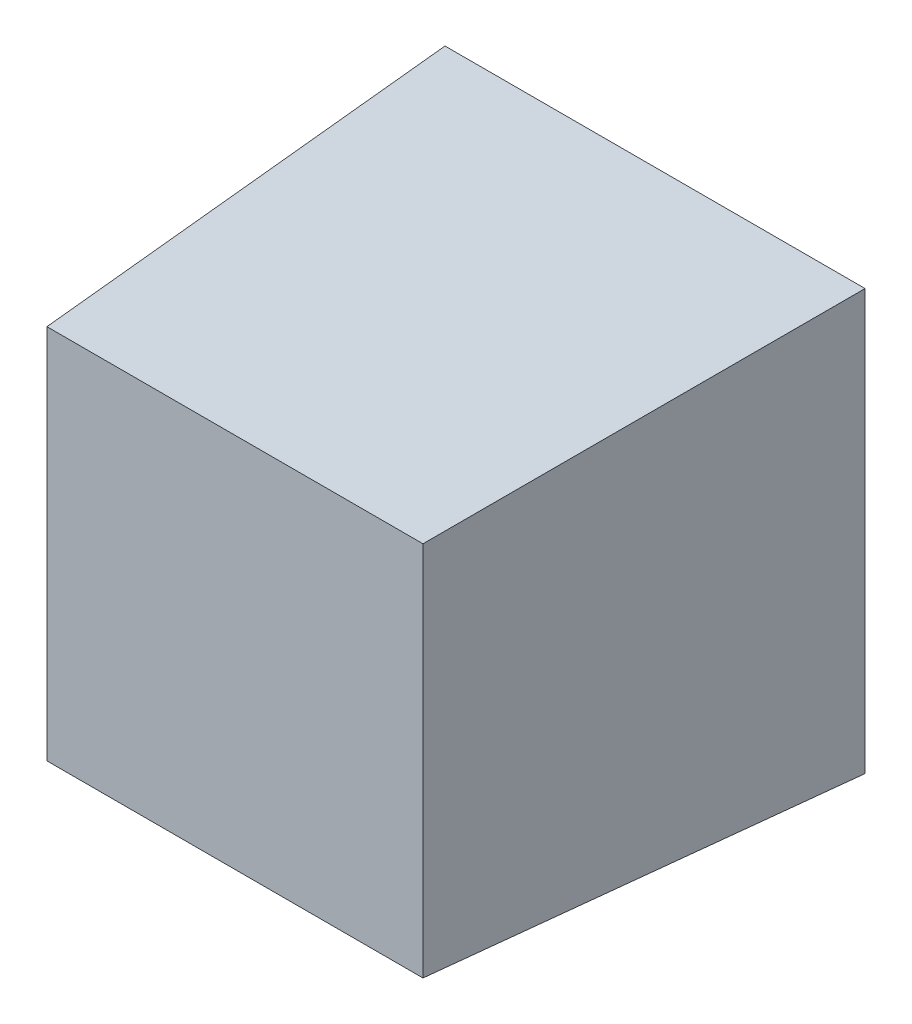
ISO-10303-21;
HEADER;
FILE_DESCRIPTION(('STEP AP214'),'2;1');
FILE_NAME('part.step','',(''),(''),'','','');
FILE_SCHEMA(('AUTOMOTIVE_DESIGN { 1 0 10303 214 1 1 1 1 }'));
ENDSEC;
DATA;
#1=APPLICATION_CONTEXT('core data for automotive mechanical design processes');
#2=APPLICATION_PROTOCOL_DEFINITION('international standard','automotive_design',2000,#1);
#3=PRODUCT_CONTEXT('',#1,'mechanical');
#4=PRODUCT('Part','Part','',(#3));
#5=PRODUCT_RELATED_PRODUCT_CATEGORY('part','',(#4));
#6=PRODUCT_DEFINITION_FORMATION('','',#4);
#7=PRODUCT_DEFINITION_CONTEXT('part definition',#1,'design');
#8=PRODUCT_DEFINITION('design','',#6,#7);
#9=PRODUCT_DEFINITION_SHAPE('','',#8);
#10=(LENGTH_UNIT() NAMED_UNIT(*) SI_UNIT(.MILLI.,.METRE.));
#11=(NAMED_UNIT(*) PLANE_ANGLE_UNIT() SI_UNIT($,.RADIAN.));
#12=(NAMED_UNIT(*) SI_UNIT($,.STERADIAN.) SOLID_ANGLE_UNIT());
#13=UNCERTAINTY_MEASURE_WITH_UNIT(LENGTH_MEASURE(1.E-05),#10,'distance_accuracy_value','');
#14=(GEOMETRIC_REPRESENTATION_CONTEXT(3) GLOBAL_UNCERTAINTY_ASSIGNED_CONTEXT((#13)) GLOBAL_UNIT_ASSIGNED_CONTEXT((#10,
#11,#12)) REPRESENTATION_CONTEXT('',''));
#15=CARTESIAN_POINT('',(0.,0.,0.));
#16=DIRECTION('',(0.,0.,1.));
#17=DIRECTION('',(1.,0.,0.));
#18=AXIS2_PLACEMENT_3D('',#15,#16,#17);
#19=CARTESIAN_POINT('',(0.,0.,0.));
#20=DIRECTION('',(-0.998629534754574,0.,0.0523359562429438));
#21=DIRECTION('',(0.0523359562429438,0.,0.998629534754574));
#22=AXIS2_PLACEMENT_3D('',#19,#20,#21);
#23=PLANE('',#22);
#24=DIRECTION('',(0.,-1.,0.));
#25=VECTOR('',#24,1.);
#26=CARTESIAN_POINT('',(0.,0.,0.));
#27=LINE('',#26,#25);
#28=CARTESIAN_POINT('',(0.,10.,0.));
#29=VERTEX_POINT('',#28);
#30=CARTESIAN_POINT('',(0.,0.,0.));
#31=VERTEX_POINT('',#30);
#32=EDGE_CURVE('E90',#29,#31,#27,.T.);
#33=ORIENTED_EDGE('',*,*,#32,.T.);
#34=DIRECTION('',(-0.0522644276887139,-0.0522644276887139,-0.997264688634237));
#35=VECTOR('',#34,1.);
#36=CARTESIAN_POINT('',(0.,0.,0.));
#37=LINE('',#36,#35);
#38=CARTESIAN_POINT('',(0.524077792830412,0.524077792830412,10.));
#39=VERTEX_POINT('',#38);
#40=EDGE_CURVE('E11',#39,#31,#37,.T.);
#41=ORIENTED_EDGE('',*,*,#40,.F.);
#42=DIRECTION('',(0.,1.,0.));
#43=VECTOR('',#42,1.);
#44=CARTESIAN_POINT('',(0.524077792830412,0.,10.));
#45=LINE('',#44,#43);
#46=CARTESIAN_POINT('',(0.524077792830412,9.47592220716959,10.));
#47=VERTEX_POINT('',#46);
#48=EDGE_CURVE('E104',#47,#39,#45,.F.);
#49=ORIENTED_EDGE('',*,*,#48,.F.);
#50=DIRECTION('',(-0.0522644276887139,0.0522644276887139,-0.997264688634237));
#51=VECTOR('',#50,1.);
#52=CARTESIAN_POINT('',(0.0273157040162881,9.97268429598371,0.521214682056319));
#53=LINE('',#52,#51);
#54=EDGE_CURVE('E99',#47,#29,#53,.T.);
#55=ORIENTED_EDGE('',*,*,#54,.T.);
#56=EDGE_LOOP('',(#33,#41,#49,#55));
#57=FACE_BOUND('',#56,.T.);
#58=ADVANCED_FACE('F43',(#57),#23,.T.);
#59=CARTESIAN_POINT('',(0.,0.,0.));
#60=DIRECTION('',(0.,-0.998629534754574,0.0523359562429438));
#61=DIRECTION('',(0.,0.0523359562429438,0.998629534754574));
#62=AXIS2_PLACEMENT_3D('',#59,#60,#61);
#63=PLANE('',#62);
#64=DIRECTION('',(1.,0.,0.));
#65=VECTOR('',#64,1.);
#66=CARTESIAN_POINT('',(0.,0.,0.));
#67=LINE('',#66,#65);
#68=CARTESIAN_POINT('',(10.,0.,0.));
#69=VERTEX_POINT('',#68);
#70=EDGE_CURVE('E81',#31,#69,#67,.T.);
#71=ORIENTED_EDGE('',*,*,#70,.T.);
#72=DIRECTION('',(0.0522644276887139,-0.0522644276887139,-0.997264688634237));
#73=VECTOR('',#72,1.);
#74=CARTESIAN_POINT('',(10.,0.,0.));
#75=LINE('',#74,#73);
#76=CARTESIAN_POINT('',(9.47592220716959,0.524077792830412,10.));
#77=VERTEX_POINT('',#76);
#78=EDGE_CURVE('E55',#77,#69,#75,.T.);
#79=ORIENTED_EDGE('',*,*,#78,.F.);
#80=DIRECTION('',(-1.,0.,0.));
#81=VECTOR('',#80,1.);
#82=CARTESIAN_POINT('',(0.,0.524077792830412,10.));
#83=LINE('',#82,#81);
#84=EDGE_CURVE('E96',#39,#77,#83,.F.);
#85=ORIENTED_EDGE('',*,*,#84,.F.);
#86=ORIENTED_EDGE('',*,*,#40,.T.);
#87=EDGE_LOOP('',(#71,#79,#85,#86));
#88=FACE_BOUND('',#87,.T.);
#89=ADVANCED_FACE('F44',(#88),#63,.T.);
#90=CARTESIAN_POINT('',(10.,0.,0.));
#91=DIRECTION('',(0.998629534754574,0.,0.0523359562429438));
#92=DIRECTION('',(-0.0523359562429438,0.,0.998629534754574));
#93=AXIS2_PLACEMENT_3D('',#90,#91,#92);
#94=PLANE('',#93);
#95=DIRECTION('',(0.,1.,0.));
#96=VECTOR('',#95,1.);
#97=CARTESIAN_POINT('',(10.,0.,0.));
#98=LINE('',#97,#96);
#99=CARTESIAN_POINT('',(10.,10.,0.));
#100=VERTEX_POINT('',#99);
#101=EDGE_CURVE('E89',#69,#100,#98,.T.);
#102=ORIENTED_EDGE('',*,*,#101,.T.);
#103=DIRECTION('',(0.0522644276887139,0.0522644276887139,-0.997264688634237));
#104=VECTOR('',#103,1.);
#105=CARTESIAN_POINT('',(9.97268429598371,9.97268429598371,0.521214682056319));
#106=LINE('',#105,#104);
#107=CARTESIAN_POINT('',(9.47592220716959,9.47592220716959,10.));
#108=VERTEX_POINT('',#107);
#109=EDGE_CURVE('E107',#108,#100,#106,.T.);
#110=ORIENTED_EDGE('',*,*,#109,.F.);
#111=DIRECTION('',(0.,-1.,0.));
#112=VECTOR('',#111,1.);
#113=CARTESIAN_POINT('',(9.47592220716959,0.,10.));
#114=LINE('',#113,#112);
#115=EDGE_CURVE('E63',#77,#108,#114,.F.);
#116=ORIENTED_EDGE('',*,*,#115,.F.);
#117=ORIENTED_EDGE('',*,*,#78,.T.);
#118=EDGE_LOOP('',(#102,#110,#116,#117));
#119=FACE_BOUND('',#118,.T.);
#120=ADVANCED_FACE('F113',(#119),#94,.T.);
#121=CARTESIAN_POINT('',(0.,10.,0.));
#122=DIRECTION('',(0.,0.998629534754574,0.0523359562429438));
#123=DIRECTION('',(0.,-0.0523359562429438,0.998629534754574));
#124=AXIS2_PLACEMENT_3D('',#121,#122,#123);
#125=PLANE('',#124);
#126=DIRECTION('',(-1.,0.,0.));
#127=VECTOR('',#126,1.);
#128=CARTESIAN_POINT('',(0.,10.,0.));
#129=LINE('',#128,#127);
#130=EDGE_CURVE('E102',#100,#29,#129,.T.);
#131=ORIENTED_EDGE('',*,*,#130,.T.);
#132=ORIENTED_EDGE('',*,*,#54,.F.);
#133=DIRECTION('',(1.,0.,0.));
#134=VECTOR('',#133,1.);
#135=CARTESIAN_POINT('',(0.,9.47592220716959,10.));
#136=LINE('',#135,#134);
#137=EDGE_CURVE('E50',#108,#47,#136,.F.);
#138=ORIENTED_EDGE('',*,*,#137,.F.);
#139=ORIENTED_EDGE('',*,*,#109,.T.);
#140=EDGE_LOOP('',(#131,#132,#138,#139));
#141=FACE_BOUND('',#140,.T.);
#142=ADVANCED_FACE('F120',(#141),#125,.T.);
#143=CARTESIAN_POINT('',(0.,0.,10.));
#144=DIRECTION('',(0.,0.,-1.));
#145=DIRECTION('',(-1.,0.,0.));
#146=AXIS2_PLACEMENT_3D('',#143,#144,#145);
#147=PLANE('',#146);
#148=ORIENTED_EDGE('',*,*,#48,.T.);
#149=ORIENTED_EDGE('',*,*,#84,.T.);
#150=ORIENTED_EDGE('',*,*,#115,.T.);
#151=ORIENTED_EDGE('',*,*,#137,.T.);
#152=EDGE_LOOP('',(#148,#149,#150,#151));
#153=FACE_BOUND('',#152,.T.);
#154=ADVANCED_FACE('F114',(#153),#147,.F.);
#155=CARTESIAN_POINT('',(0.,0.,0.));
#156=DIRECTION('',(0.,0.,-1.));
#157=DIRECTION('',(-1.,0.,0.));
#158=AXIS2_PLACEMENT_3D('',#155,#156,#157);
#159=PLANE('',#158);
#160=ORIENTED_EDGE('',*,*,#32,.F.);
#161=ORIENTED_EDGE('',*,*,#130,.F.);
#162=ORIENTED_EDGE('',*,*,#101,.F.);
#163=ORIENTED_EDGE('',*,*,#70,.F.);
#164=EDGE_LOOP('',(#160,#161,#162,#163));
#165=FACE_BOUND('',#164,.T.);
#166=ADVANCED_FACE('F88',(#165),#159,.T.);
#167=CLOSED_SHELL('',(#58,#89,#120,#142,#154,#166));
#168=MANIFOLD_SOLID_BREP('B2',#167);
#169=ADVANCED_BREP_SHAPE_REPRESENTATION('',(#18,#168),#14);
#170=SHAPE_DEFINITION_REPRESENTATION(#9,#169);
ENDSEC;
END-ISO-10303-21;
